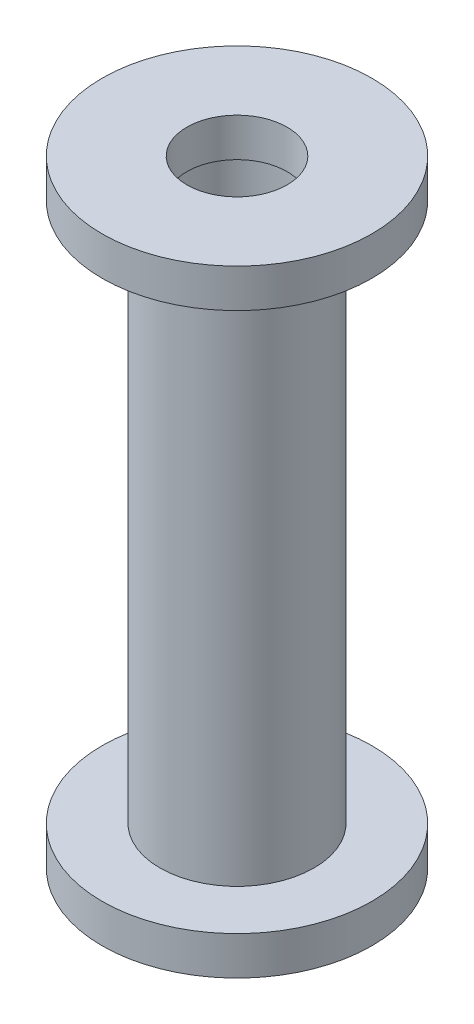
ISO-10303-21;
HEADER;
FILE_DESCRIPTION(('STEP AP214'),'2;1');
FILE_NAME('part.step','',(''),(''),'','','');
FILE_SCHEMA(('AUTOMOTIVE_DESIGN { 1 0 10303 214 1 1 1 1 }'));
ENDSEC;
DATA;
#1=APPLICATION_CONTEXT('core data for automotive mechanical design processes');
#2=APPLICATION_PROTOCOL_DEFINITION('international standard','automotive_design',2000,#1);
#3=PRODUCT_CONTEXT('',#1,'mechanical');
#4=PRODUCT('Part','Part','',(#3));
#5=PRODUCT_RELATED_PRODUCT_CATEGORY('part','',(#4));
#6=PRODUCT_DEFINITION_FORMATION('','',#4);
#7=PRODUCT_DEFINITION_CONTEXT('part definition',#1,'design');
#8=PRODUCT_DEFINITION('design','',#6,#7);
#9=PRODUCT_DEFINITION_SHAPE('','',#8);
#10=(LENGTH_UNIT() NAMED_UNIT(*) SI_UNIT(.MILLI.,.METRE.));
#11=(NAMED_UNIT(*) PLANE_ANGLE_UNIT() SI_UNIT($,.RADIAN.));
#12=(NAMED_UNIT(*) SI_UNIT($,.STERADIAN.) SOLID_ANGLE_UNIT());
#13=UNCERTAINTY_MEASURE_WITH_UNIT(LENGTH_MEASURE(1.E-05),#10,'distance_accuracy_value','');
#14=(GEOMETRIC_REPRESENTATION_CONTEXT(3) GLOBAL_UNCERTAINTY_ASSIGNED_CONTEXT((#13)) GLOBAL_UNIT_ASSIGNED_CONTEXT((#10,
#11,#12)) REPRESENTATION_CONTEXT('',''));
#15=CARTESIAN_POINT('',(0.,0.,0.));
#16=DIRECTION('',(0.,0.,1.));
#17=DIRECTION('',(1.,0.,0.));
#18=AXIS2_PLACEMENT_3D('',#15,#16,#17);
#19=CARTESIAN_POINT('',(0.,2.,0.));
#20=DIRECTION('',(0.,-1.,0.));
#21=DIRECTION('',(0.,0.,-1.));
#22=AXIS2_PLACEMENT_3D('',#19,#20,#21);
#23=CYLINDRICAL_SURFACE('',#22,7.);
#24=CARTESIAN_POINT('',(0.,2.,0.));
#25=DIRECTION('',(0.,1.,0.));
#26=DIRECTION('',(0.,0.,1.));
#27=AXIS2_PLACEMENT_3D('',#24,#25,#26);
#28=CIRCLE('',#27,7.);
#29=CARTESIAN_POINT('',(0.,2.,7.));
#30=VERTEX_POINT('',#29);
#31=EDGE_CURVE('E51',#30,#30,#28,.T.);
#32=ORIENTED_EDGE('',*,*,#31,.F.);
#33=EDGE_LOOP('',(#32));
#34=FACE_BOUND('',#33,.T.);
#35=CARTESIAN_POINT('',(0.,0.,0.));
#36=DIRECTION('',(0.,1.,0.));
#37=DIRECTION('',(0.,0.,1.));
#38=AXIS2_PLACEMENT_3D('',#35,#36,#37);
#39=CIRCLE('',#38,7.);
#40=CARTESIAN_POINT('',(0.,0.,7.));
#41=VERTEX_POINT('',#40);
#42=EDGE_CURVE('E46',#41,#41,#39,.T.);
#43=ORIENTED_EDGE('',*,*,#42,.T.);
#44=EDGE_LOOP('',(#43));
#45=FACE_BOUND('',#44,.T.);
#46=ADVANCED_FACE('F43',(#34,#45),#23,.T.);
#47=CARTESIAN_POINT('',(0.,2.,0.));
#48=DIRECTION('',(0.,1.,0.));
#49=DIRECTION('',(0.,0.,1.));
#50=AXIS2_PLACEMENT_3D('',#47,#48,#49);
#51=PLANE('',#50);
#52=CARTESIAN_POINT('',(0.,2.,0.));
#53=DIRECTION('',(0.,1.,0.));
#54=DIRECTION('',(0.,0.,1.));
#55=AXIS2_PLACEMENT_3D('',#52,#53,#54);
#56=CIRCLE('',#55,4.);
#57=CARTESIAN_POINT('',(0.,2.,4.));
#58=VERTEX_POINT('',#57);
#59=EDGE_CURVE('E10',#58,#58,#56,.T.);
#60=ORIENTED_EDGE('',*,*,#59,.F.);
#61=EDGE_LOOP('',(#60));
#62=FACE_BOUND('',#61,.T.);
#63=ORIENTED_EDGE('',*,*,#31,.T.);
#64=EDGE_LOOP('',(#63));
#65=FACE_BOUND('',#64,.T.);
#66=ADVANCED_FACE('F122',(#62,#65),#51,.T.);
#67=CARTESIAN_POINT('',(0.,0.,0.));
#68=DIRECTION('',(0.,1.,0.));
#69=DIRECTION('',(0.,0.,1.));
#70=AXIS2_PLACEMENT_3D('',#67,#68,#69);
#71=PLANE('',#70);
#72=CARTESIAN_POINT('',(0.,0.,0.));
#73=DIRECTION('',(0.,1.,0.));
#74=DIRECTION('',(0.,0.,1.));
#75=AXIS2_PLACEMENT_3D('',#72,#73,#74);
#76=CIRCLE('',#75,2.75);
#77=CARTESIAN_POINT('',(0.,0.,2.75));
#78=VERTEX_POINT('',#77);
#79=EDGE_CURVE('E65',#78,#78,#76,.T.);
#80=ORIENTED_EDGE('',*,*,#79,.T.);
#81=EDGE_LOOP('',(#80));
#82=FACE_BOUND('',#81,.T.);
#83=ORIENTED_EDGE('',*,*,#42,.F.);
#84=EDGE_LOOP('',(#83));
#85=FACE_BOUND('',#84,.T.);
#86=ADVANCED_FACE('F127',(#82,#85),#71,.F.);
#87=CARTESIAN_POINT('',(0.,30.,0.));
#88=DIRECTION('',(0.,-1.,0.));
#89=DIRECTION('',(0.,0.,-1.));
#90=AXIS2_PLACEMENT_3D('',#87,#88,#89);
#91=CYLINDRICAL_SURFACE('',#90,4.);
#92=CARTESIAN_POINT('',(0.,30.,0.));
#93=DIRECTION('',(0.,1.,0.));
#94=DIRECTION('',(0.,0.,1.));
#95=AXIS2_PLACEMENT_3D('',#92,#93,#94);
#96=CIRCLE('',#95,4.);
#97=CARTESIAN_POINT('',(0.,30.,4.));
#98=VERTEX_POINT('',#97);
#99=EDGE_CURVE('E59',#98,#98,#96,.T.);
#100=ORIENTED_EDGE('',*,*,#99,.F.);
#101=EDGE_LOOP('',(#100));
#102=FACE_BOUND('',#101,.T.);
#103=ORIENTED_EDGE('',*,*,#59,.T.);
#104=EDGE_LOOP('',(#103));
#105=FACE_BOUND('',#104,.T.);
#106=ADVANCED_FACE('F116',(#102,#105),#91,.T.);
#107=CARTESIAN_POINT('',(0.,0.,0.));
#108=DIRECTION('',(0.,1.,0.));
#109=DIRECTION('',(0.,0.,1.));
#110=AXIS2_PLACEMENT_3D('',#107,#108,#109);
#111=CYLINDRICAL_SURFACE('',#110,2.75);
#112=ORIENTED_EDGE('',*,*,#79,.F.);
#113=EDGE_LOOP('',(#112));
#114=FACE_BOUND('',#113,.T.);
#115=CARTESIAN_POINT('',(0.,30.,0.));
#116=DIRECTION('',(0.,1.,0.));
#117=DIRECTION('',(0.,0.,1.));
#118=AXIS2_PLACEMENT_3D('',#115,#116,#117);
#119=CIRCLE('',#118,2.75);
#120=CARTESIAN_POINT('',(0.,30.,2.75));
#121=VERTEX_POINT('',#120);
#122=EDGE_CURVE('E64',#121,#121,#119,.T.);
#123=ORIENTED_EDGE('',*,*,#122,.T.);
#124=EDGE_LOOP('',(#123));
#125=FACE_BOUND('',#124,.T.);
#126=ADVANCED_FACE('F109',(#114,#125),#111,.F.);
#127=CARTESIAN_POINT('',(0.,30.,0.));
#128=DIRECTION('',(0.,1.,0.));
#129=DIRECTION('',(0.,0.,1.));
#130=AXIS2_PLACEMENT_3D('',#127,#128,#129);
#131=PLANE('',#130);
#132=ORIENTED_EDGE('',*,*,#99,.T.);
#133=EDGE_LOOP('',(#132));
#134=FACE_BOUND('',#133,.T.);
#135=CARTESIAN_POINT('',(0.,30.,0.));
#136=DIRECTION('',(0.,1.,0.));
#137=DIRECTION('',(0.,0.,1.));
#138=AXIS2_PLACEMENT_3D('',#135,#136,#137);
#139=CIRCLE('',#138,7.);
#140=CARTESIAN_POINT('',(0.,30.,7.));
#141=VERTEX_POINT('',#140);
#142=EDGE_CURVE('E74',#141,#141,#139,.T.);
#143=ORIENTED_EDGE('',*,*,#142,.F.);
#144=EDGE_LOOP('',(#143));
#145=FACE_BOUND('',#144,.T.);
#146=ADVANCED_FACE('F99',(#134,#145),#131,.F.);
#147=CARTESIAN_POINT('',(0.,32.,0.));
#148=DIRECTION('',(0.,1.,0.));
#149=DIRECTION('',(0.,0.,1.));
#150=AXIS2_PLACEMENT_3D('',#147,#148,#149);
#151=PLANE('',#150);
#152=CARTESIAN_POINT('',(0.,32.,0.));
#153=DIRECTION('',(0.,1.,0.));
#154=DIRECTION('',(0.,0.,1.));
#155=AXIS2_PLACEMENT_3D('',#152,#153,#154);
#156=CIRCLE('',#155,2.6);
#157=CARTESIAN_POINT('',(0.,32.,2.6));
#158=VERTEX_POINT('',#157);
#159=EDGE_CURVE('E79',#158,#158,#156,.T.);
#160=ORIENTED_EDGE('',*,*,#159,.F.);
#161=EDGE_LOOP('',(#160));
#162=FACE_BOUND('',#161,.T.);
#163=CARTESIAN_POINT('',(0.,32.,0.));
#164=DIRECTION('',(0.,1.,0.));
#165=DIRECTION('',(0.,0.,1.));
#166=AXIS2_PLACEMENT_3D('',#163,#164,#165);
#167=CIRCLE('',#166,7.);
#168=CARTESIAN_POINT('',(0.,32.,7.));
#169=VERTEX_POINT('',#168);
#170=EDGE_CURVE('E70',#169,#169,#167,.T.);
#171=ORIENTED_EDGE('',*,*,#170,.T.);
#172=EDGE_LOOP('',(#171));
#173=FACE_BOUND('',#172,.T.);
#174=ADVANCED_FACE('F98',(#162,#173),#151,.T.);
#175=CARTESIAN_POINT('',(0.,32.,0.));
#176=DIRECTION('',(0.,-1.,0.));
#177=DIRECTION('',(0.,0.,-1.));
#178=AXIS2_PLACEMENT_3D('',#175,#176,#177);
#179=CYLINDRICAL_SURFACE('',#178,7.);
#180=ORIENTED_EDGE('',*,*,#170,.F.);
#181=EDGE_LOOP('',(#180));
#182=FACE_BOUND('',#181,.T.);
#183=ORIENTED_EDGE('',*,*,#142,.T.);
#184=EDGE_LOOP('',(#183));
#185=FACE_BOUND('',#184,.T.);
#186=ADVANCED_FACE('F100',(#182,#185),#179,.T.);
#187=CARTESIAN_POINT('',(0.,30.,0.));
#188=DIRECTION('',(0.,1.,0.));
#189=DIRECTION('',(0.,0.,1.));
#190=AXIS2_PLACEMENT_3D('',#187,#188,#189);
#191=CIRCLE('',#190,2.6);
#192=CARTESIAN_POINT('',(0.,30.,2.6));
#193=VERTEX_POINT('',#192);
#194=EDGE_CURVE('E72',#193,#193,#191,.T.);
#195=ORIENTED_EDGE('',*,*,#194,.T.);
#196=EDGE_LOOP('',(#195));
#197=FACE_BOUND('',#196,.T.);
#198=ORIENTED_EDGE('',*,*,#122,.F.);
#199=EDGE_LOOP('',(#198));
#200=FACE_BOUND('',#199,.T.);
#201=ADVANCED_FACE('F90',(#197,#200),#131,.F.);
#202=CARTESIAN_POINT('',(0.,30.,0.));
#203=DIRECTION('',(0.,1.,0.));
#204=DIRECTION('',(0.,0.,1.));
#205=AXIS2_PLACEMENT_3D('',#202,#203,#204);
#206=CYLINDRICAL_SURFACE('',#205,2.6);
#207=ORIENTED_EDGE('',*,*,#194,.F.);
#208=EDGE_LOOP('',(#207));
#209=FACE_BOUND('',#208,.T.);
#210=ORIENTED_EDGE('',*,*,#159,.T.);
#211=EDGE_LOOP('',(#210));
#212=FACE_BOUND('',#211,.T.);
#213=ADVANCED_FACE('F88',(#209,#212),#206,.F.);
#214=CLOSED_SHELL('',(#46,#66,#86,#106,#126,#146,#174,#186,#201,#213));
#215=MANIFOLD_SOLID_BREP('B2',#214);
#216=ADVANCED_BREP_SHAPE_REPRESENTATION('',(#18,#215),#14);
#217=SHAPE_DEFINITION_REPRESENTATION(#9,#216);
ENDSEC;
END-ISO-10303-21;
